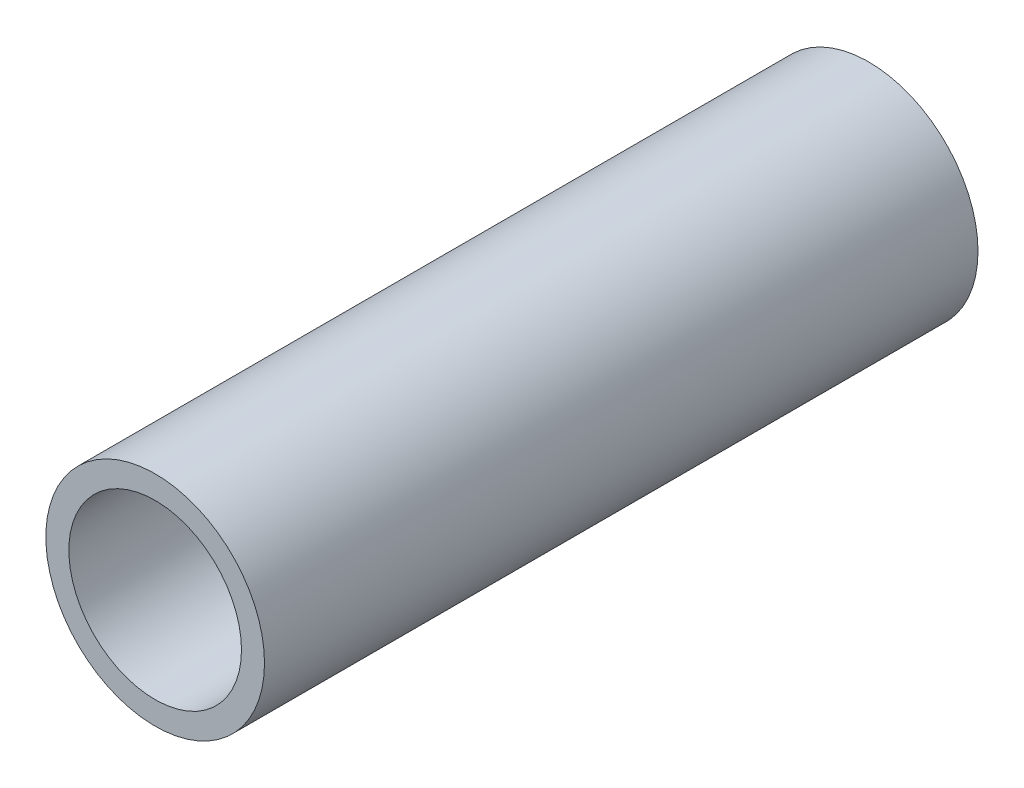
ISO-10303-21;
HEADER;
FILE_DESCRIPTION(('STEP AP214'),'2;1');
FILE_NAME('part.step','',(''),(''),'','','');
FILE_SCHEMA(('AUTOMOTIVE_DESIGN { 1 0 10303 214 1 1 1 1 }'));
ENDSEC;
DATA;
#1=APPLICATION_CONTEXT('core data for automotive mechanical design processes');
#2=APPLICATION_PROTOCOL_DEFINITION('international standard','automotive_design',2000,#1);
#3=PRODUCT_CONTEXT('',#1,'mechanical');
#4=PRODUCT('Part','Part','',(#3));
#5=PRODUCT_RELATED_PRODUCT_CATEGORY('part','',(#4));
#6=PRODUCT_DEFINITION_FORMATION('','',#4);
#7=PRODUCT_DEFINITION_CONTEXT('part definition',#1,'design');
#8=PRODUCT_DEFINITION('design','',#6,#7);
#9=PRODUCT_DEFINITION_SHAPE('','',#8);
#10=(LENGTH_UNIT() NAMED_UNIT(*) SI_UNIT(.MILLI.,.METRE.));
#11=(NAMED_UNIT(*) PLANE_ANGLE_UNIT() SI_UNIT($,.RADIAN.));
#12=(NAMED_UNIT(*) SI_UNIT($,.STERADIAN.) SOLID_ANGLE_UNIT());
#13=UNCERTAINTY_MEASURE_WITH_UNIT(LENGTH_MEASURE(1.E-05),#10,'distance_accuracy_value','');
#14=(GEOMETRIC_REPRESENTATION_CONTEXT(3) GLOBAL_UNCERTAINTY_ASSIGNED_CONTEXT((#13)) GLOBAL_UNIT_ASSIGNED_CONTEXT((#10,
#11,#12)) REPRESENTATION_CONTEXT('',''));
#15=CARTESIAN_POINT('',(0.,0.,0.));
#16=DIRECTION('',(0.,0.,1.));
#17=DIRECTION('',(1.,0.,0.));
#18=AXIS2_PLACEMENT_3D('',#15,#16,#17);
#19=CARTESIAN_POINT('',(0.,0.,62.));
#20=DIRECTION('',(0.,0.,1.));
#21=DIRECTION('',(1.,0.,0.));
#22=AXIS2_PLACEMENT_3D('',#19,#20,#21);
#23=PLANE('',#22);
#24=CARTESIAN_POINT('',(0.,0.,62.));
#25=DIRECTION('',(0.,0.,1.));
#26=DIRECTION('',(1.,0.,0.));
#27=AXIS2_PLACEMENT_3D('',#24,#25,#26);
#28=CIRCLE('',#27,9.5);
#29=CARTESIAN_POINT('',(9.5,0.,62.));
#30=VERTEX_POINT('',#29);
#31=EDGE_CURVE('E10',#30,#30,#28,.T.);
#32=ORIENTED_EDGE('',*,*,#31,.T.);
#33=EDGE_LOOP('',(#32));
#34=FACE_BOUND('',#33,.T.);
#35=CARTESIAN_POINT('',(0.,0.,62.));
#36=DIRECTION('',(0.,0.,1.));
#37=DIRECTION('',(1.,0.,0.));
#38=AXIS2_PLACEMENT_3D('',#35,#36,#37);
#39=CIRCLE('',#38,7.5);
#40=CARTESIAN_POINT('',(7.5,0.,62.));
#41=VERTEX_POINT('',#40);
#42=EDGE_CURVE('E50',#41,#41,#39,.T.);
#43=ORIENTED_EDGE('',*,*,#42,.F.);
#44=EDGE_LOOP('',(#43));
#45=FACE_BOUND('',#44,.T.);
#46=ADVANCED_FACE('F37',(#34,#45),#23,.T.);
#47=CARTESIAN_POINT('',(0.,0.,0.));
#48=DIRECTION('',(0.,0.,1.));
#49=DIRECTION('',(1.,0.,0.));
#50=AXIS2_PLACEMENT_3D('',#47,#48,#49);
#51=PLANE('',#50);
#52=CARTESIAN_POINT('',(0.,0.,0.));
#53=DIRECTION('',(0.,0.,1.));
#54=DIRECTION('',(1.,0.,0.));
#55=AXIS2_PLACEMENT_3D('',#52,#53,#54);
#56=CIRCLE('',#55,9.5);
#57=CARTESIAN_POINT('',(9.5,0.,0.));
#58=VERTEX_POINT('',#57);
#59=EDGE_CURVE('E41',#58,#58,#56,.T.);
#60=ORIENTED_EDGE('',*,*,#59,.F.);
#61=EDGE_LOOP('',(#60));
#62=FACE_BOUND('',#61,.T.);
#63=CARTESIAN_POINT('',(0.,0.,0.));
#64=DIRECTION('',(0.,0.,1.));
#65=DIRECTION('',(1.,0.,0.));
#66=AXIS2_PLACEMENT_3D('',#63,#64,#65);
#67=CIRCLE('',#66,7.5);
#68=CARTESIAN_POINT('',(7.5,0.,0.));
#69=VERTEX_POINT('',#68);
#70=EDGE_CURVE('E52',#69,#69,#67,.T.);
#71=ORIENTED_EDGE('',*,*,#70,.T.);
#72=EDGE_LOOP('',(#71));
#73=FACE_BOUND('',#72,.T.);
#74=ADVANCED_FACE('F64',(#62,#73),#51,.F.);
#75=CARTESIAN_POINT('',(0.,0.,62.));
#76=DIRECTION('',(0.,0.,-1.));
#77=DIRECTION('',(-1.,0.,0.));
#78=AXIS2_PLACEMENT_3D('',#75,#76,#77);
#79=CYLINDRICAL_SURFACE('',#78,9.5);
#80=ORIENTED_EDGE('',*,*,#31,.F.);
#81=EDGE_LOOP('',(#80));
#82=FACE_BOUND('',#81,.T.);
#83=ORIENTED_EDGE('',*,*,#59,.T.);
#84=EDGE_LOOP('',(#83));
#85=FACE_BOUND('',#84,.T.);
#86=ADVANCED_FACE('F39',(#82,#85),#79,.T.);
#87=CARTESIAN_POINT('',(0.,0.,62.));
#88=DIRECTION('',(0.,0.,-1.));
#89=DIRECTION('',(-1.,0.,0.));
#90=AXIS2_PLACEMENT_3D('',#87,#88,#89);
#91=CYLINDRICAL_SURFACE('',#90,7.5);
#92=ORIENTED_EDGE('',*,*,#42,.T.);
#93=EDGE_LOOP('',(#92));
#94=FACE_BOUND('',#93,.T.);
#95=ORIENTED_EDGE('',*,*,#70,.F.);
#96=EDGE_LOOP('',(#95));
#97=FACE_BOUND('',#96,.T.);
#98=ADVANCED_FACE('F60',(#94,#97),#91,.F.);
#99=CLOSED_SHELL('',(#46,#74,#86,#98));
#100=MANIFOLD_SOLID_BREP('B2',#99);
#101=ADVANCED_BREP_SHAPE_REPRESENTATION('',(#18,#100),#14);
#102=SHAPE_DEFINITION_REPRESENTATION(#9,#101);
ENDSEC;
END-ISO-10303-21;
